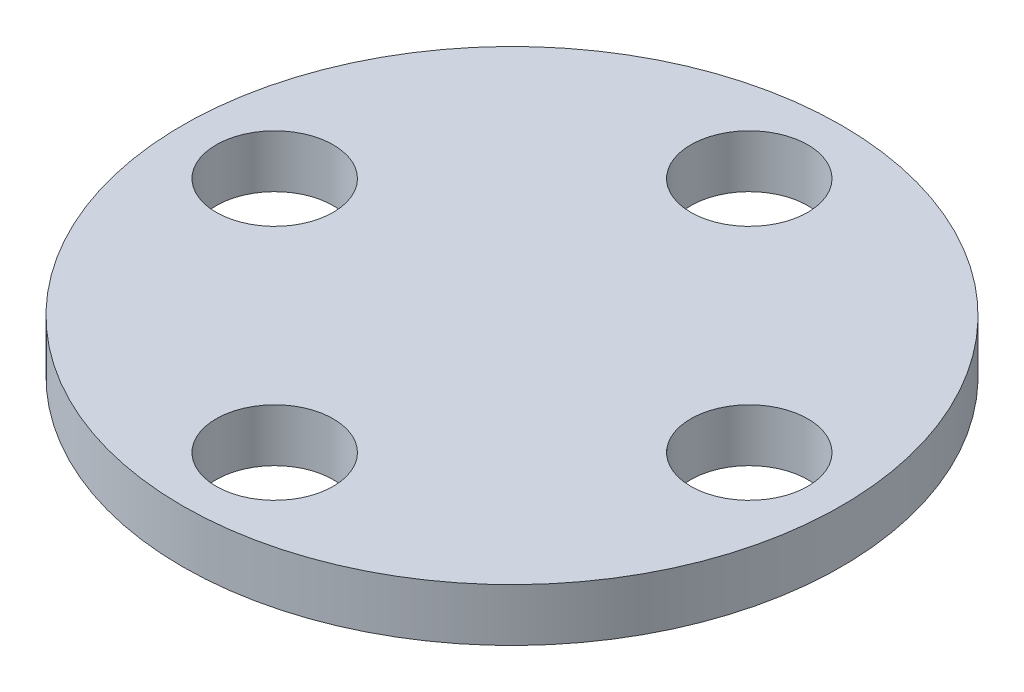
ISO-10303-21;
HEADER;
FILE_DESCRIPTION(('STEP AP214'),'2;1');
FILE_NAME('part.step','',(''),(''),'','','');
FILE_SCHEMA(('AUTOMOTIVE_DESIGN { 1 0 10303 214 1 1 1 1 }'));
ENDSEC;
DATA;
#1=APPLICATION_CONTEXT('core data for automotive mechanical design processes');
#2=APPLICATION_PROTOCOL_DEFINITION('international standard','automotive_design',2000,#1);
#3=PRODUCT_CONTEXT('',#1,'mechanical');
#4=PRODUCT('Part','Part','',(#3));
#5=PRODUCT_RELATED_PRODUCT_CATEGORY('part','',(#4));
#6=PRODUCT_DEFINITION_FORMATION('','',#4);
#7=PRODUCT_DEFINITION_CONTEXT('part definition',#1,'design');
#8=PRODUCT_DEFINITION('design','',#6,#7);
#9=PRODUCT_DEFINITION_SHAPE('','',#8);
#10=(LENGTH_UNIT() NAMED_UNIT(*) SI_UNIT(.MILLI.,.METRE.));
#11=(NAMED_UNIT(*) PLANE_ANGLE_UNIT() SI_UNIT($,.RADIAN.));
#12=(NAMED_UNIT(*) SI_UNIT($,.STERADIAN.) SOLID_ANGLE_UNIT());
#13=UNCERTAINTY_MEASURE_WITH_UNIT(LENGTH_MEASURE(1.E-05),#10,'distance_accuracy_value','');
#14=(GEOMETRIC_REPRESENTATION_CONTEXT(3) GLOBAL_UNCERTAINTY_ASSIGNED_CONTEXT((#13)) GLOBAL_UNIT_ASSIGNED_CONTEXT((#10,
#11,#12)) REPRESENTATION_CONTEXT('',''));
#15=CARTESIAN_POINT('',(0.,0.,0.));
#16=DIRECTION('',(0.,0.,1.));
#17=DIRECTION('',(1.,0.,0.));
#18=AXIS2_PLACEMENT_3D('',#15,#16,#17);
#19=CARTESIAN_POINT('',(0.,2.54,0.));
#20=DIRECTION('',(0.,-1.,0.));
#21=DIRECTION('',(0.,0.,-1.));
#22=AXIS2_PLACEMENT_3D('',#19,#20,#21);
#23=CYLINDRICAL_SURFACE('',#22,15.875);
#24=CARTESIAN_POINT('',(0.,2.54,0.));
#25=DIRECTION('',(0.,1.,0.));
#26=DIRECTION('',(0.,0.,1.));
#27=AXIS2_PLACEMENT_3D('',#24,#25,#26);
#28=CIRCLE('',#27,15.875);
#29=CARTESIAN_POINT('',(0.,2.54,15.875));
#30=VERTEX_POINT('',#29);
#31=EDGE_CURVE('E10',#30,#30,#28,.T.);
#32=ORIENTED_EDGE('',*,*,#31,.F.);
#33=EDGE_LOOP('',(#32));
#34=FACE_BOUND('',#33,.T.);
#35=CARTESIAN_POINT('',(0.,0.,0.));
#36=DIRECTION('',(0.,1.,0.));
#37=DIRECTION('',(0.,0.,1.));
#38=AXIS2_PLACEMENT_3D('',#35,#36,#37);
#39=CIRCLE('',#38,15.875);
#40=CARTESIAN_POINT('',(0.,0.,15.875));
#41=VERTEX_POINT('',#40);
#42=EDGE_CURVE('E40',#41,#41,#39,.T.);
#43=ORIENTED_EDGE('',*,*,#42,.T.);
#44=EDGE_LOOP('',(#43));
#45=FACE_BOUND('',#44,.T.);
#46=ADVANCED_FACE('F37',(#34,#45),#23,.T.);
#47=CARTESIAN_POINT('',(0.,2.54,0.));
#48=DIRECTION('',(0.,1.,0.));
#49=DIRECTION('',(0.,0.,1.));
#50=AXIS2_PLACEMENT_3D('',#47,#48,#49);
#51=PLANE('',#50);
#52=CARTESIAN_POINT('',(0.,2.54,-11.43));
#53=DIRECTION('',(0.,1.,0.));
#54=DIRECTION('',(0.,0.,1.));
#55=AXIS2_PLACEMENT_3D('',#52,#53,#54);
#56=CIRCLE('',#55,2.8194);
#57=CARTESIAN_POINT('',(0.,2.54,-8.6106));
#58=VERTEX_POINT('',#57);
#59=EDGE_CURVE('E75',#58,#58,#56,.T.);
#60=ORIENTED_EDGE('',*,*,#59,.F.);
#61=EDGE_LOOP('',(#60));
#62=FACE_BOUND('',#61,.T.);
#63=CARTESIAN_POINT('',(11.4300000000003,2.54,-3.23460367498092E-13));
#64=DIRECTION('',(0.,1.,0.));
#65=DIRECTION('',(0.,0.,1.));
#66=AXIS2_PLACEMENT_3D('',#63,#64,#65);
#67=CIRCLE('',#66,2.81940000000025);
#68=CARTESIAN_POINT('',(11.4300000000003,2.54,2.81939999999993));
#69=VERTEX_POINT('',#68);
#70=EDGE_CURVE('E67',#69,#69,#67,.T.);
#71=ORIENTED_EDGE('',*,*,#70,.F.);
#72=EDGE_LOOP('',(#71));
#73=FACE_BOUND('',#72,.T.);
#74=CARTESIAN_POINT('',(6.46920734996185E-13,2.54,11.43));
#75=DIRECTION('',(0.,1.,0.));
#76=DIRECTION('',(0.,0.,1.));
#77=AXIS2_PLACEMENT_3D('',#74,#75,#76);
#78=CIRCLE('',#77,2.81940000000069);
#79=CARTESIAN_POINT('',(6.46920734996185E-13,2.54,14.2494000000007));
#80=VERTEX_POINT('',#79);
#81=EDGE_CURVE('E59',#80,#80,#78,.T.);
#82=ORIENTED_EDGE('',*,*,#81,.F.);
#83=EDGE_LOOP('',(#82));
#84=FACE_BOUND('',#83,.T.);
#85=CARTESIAN_POINT('',(-11.4299999999997,2.54,3.24860138789518E-13));
#86=DIRECTION('',(0.,1.,0.));
#87=DIRECTION('',(0.,0.,1.));
#88=AXIS2_PLACEMENT_3D('',#85,#86,#87);
#89=CIRCLE('',#88,2.81940000000052);
#90=CARTESIAN_POINT('',(-11.4299999999997,2.54,2.81940000000084));
#91=VERTEX_POINT('',#90);
#92=EDGE_CURVE('E51',#91,#91,#89,.T.);
#93=ORIENTED_EDGE('',*,*,#92,.F.);
#94=EDGE_LOOP('',(#93));
#95=FACE_BOUND('',#94,.T.);
#96=ORIENTED_EDGE('',*,*,#31,.T.);
#97=EDGE_LOOP('',(#96));
#98=FACE_BOUND('',#97,.T.);
#99=ADVANCED_FACE('F93',(#62,#73,#84,#95,#98),#51,.T.);
#100=CARTESIAN_POINT('',(0.,0.,0.));
#101=DIRECTION('',(0.,1.,0.));
#102=DIRECTION('',(0.,0.,1.));
#103=AXIS2_PLACEMENT_3D('',#100,#101,#102);
#104=PLANE('',#103);
#105=CARTESIAN_POINT('',(0.,0.,-11.43));
#106=DIRECTION('',(0.,1.,0.));
#107=DIRECTION('',(0.,0.,1.));
#108=AXIS2_PLACEMENT_3D('',#105,#106,#107);
#109=CIRCLE('',#108,2.8194);
#110=CARTESIAN_POINT('',(0.,0.,-8.6106));
#111=VERTEX_POINT('',#110);
#112=EDGE_CURVE('E49',#111,#111,#109,.T.);
#113=ORIENTED_EDGE('',*,*,#112,.T.);
#114=EDGE_LOOP('',(#113));
#115=FACE_BOUND('',#114,.T.);
#116=CARTESIAN_POINT('',(11.4300000000003,0.,-3.23460367498092E-13));
#117=DIRECTION('',(0.,1.,0.));
#118=DIRECTION('',(0.,0.,1.));
#119=AXIS2_PLACEMENT_3D('',#116,#117,#118);
#120=CIRCLE('',#119,2.81940000000025);
#121=CARTESIAN_POINT('',(11.4300000000003,0.,2.81939999999993));
#122=VERTEX_POINT('',#121);
#123=EDGE_CURVE('E71',#122,#122,#120,.T.);
#124=ORIENTED_EDGE('',*,*,#123,.T.);
#125=EDGE_LOOP('',(#124));
#126=FACE_BOUND('',#125,.T.);
#127=CARTESIAN_POINT('',(6.46920734996185E-13,0.,11.43));
#128=DIRECTION('',(0.,1.,0.));
#129=DIRECTION('',(0.,0.,1.));
#130=AXIS2_PLACEMENT_3D('',#127,#128,#129);
#131=CIRCLE('',#130,2.81940000000069);
#132=CARTESIAN_POINT('',(6.46920734996185E-13,0.,14.2494000000007));
#133=VERTEX_POINT('',#132);
#134=EDGE_CURVE('E63',#133,#133,#131,.T.);
#135=ORIENTED_EDGE('',*,*,#134,.T.);
#136=EDGE_LOOP('',(#135));
#137=FACE_BOUND('',#136,.T.);
#138=CARTESIAN_POINT('',(-11.4299999999997,0.,3.24860138789518E-13));
#139=DIRECTION('',(0.,1.,0.));
#140=DIRECTION('',(0.,0.,1.));
#141=AXIS2_PLACEMENT_3D('',#138,#139,#140);
#142=CIRCLE('',#141,2.81940000000052);
#143=CARTESIAN_POINT('',(-11.4299999999997,0.,2.81940000000084));
#144=VERTEX_POINT('',#143);
#145=EDGE_CURVE('E55',#144,#144,#142,.T.);
#146=ORIENTED_EDGE('',*,*,#145,.T.);
#147=EDGE_LOOP('',(#146));
#148=FACE_BOUND('',#147,.T.);
#149=ORIENTED_EDGE('',*,*,#42,.F.);
#150=EDGE_LOOP('',(#149));
#151=FACE_BOUND('',#150,.T.);
#152=ADVANCED_FACE('F83',(#115,#126,#137,#148,#151),#104,.F.);
#153=CARTESIAN_POINT('',(-11.4299999999997,0.,3.24860138789518E-13));
#154=DIRECTION('',(0.,1.,0.));
#155=DIRECTION('',(0.,0.,1.));
#156=AXIS2_PLACEMENT_3D('',#153,#154,#155);
#157=CYLINDRICAL_SURFACE('',#156,2.81940000000052);
#158=ORIENTED_EDGE('',*,*,#145,.F.);
#159=EDGE_LOOP('',(#158));
#160=FACE_BOUND('',#159,.T.);
#161=ORIENTED_EDGE('',*,*,#92,.T.);
#162=EDGE_LOOP('',(#161));
#163=FACE_BOUND('',#162,.T.);
#164=ADVANCED_FACE('F103',(#160,#163),#157,.F.);
#165=CARTESIAN_POINT('',(6.46920734996185E-13,0.,11.43));
#166=DIRECTION('',(0.,1.,0.));
#167=DIRECTION('',(0.,0.,1.));
#168=AXIS2_PLACEMENT_3D('',#165,#166,#167);
#169=CYLINDRICAL_SURFACE('',#168,2.81940000000069);
#170=ORIENTED_EDGE('',*,*,#134,.F.);
#171=EDGE_LOOP('',(#170));
#172=FACE_BOUND('',#171,.T.);
#173=ORIENTED_EDGE('',*,*,#81,.T.);
#174=EDGE_LOOP('',(#173));
#175=FACE_BOUND('',#174,.T.);
#176=ADVANCED_FACE('F105',(#172,#175),#169,.F.);
#177=CARTESIAN_POINT('',(11.4300000000003,0.,-3.23460367498092E-13));
#178=DIRECTION('',(0.,1.,0.));
#179=DIRECTION('',(0.,0.,1.));
#180=AXIS2_PLACEMENT_3D('',#177,#178,#179);
#181=CYLINDRICAL_SURFACE('',#180,2.81940000000025);
#182=ORIENTED_EDGE('',*,*,#123,.F.);
#183=EDGE_LOOP('',(#182));
#184=FACE_BOUND('',#183,.T.);
#185=ORIENTED_EDGE('',*,*,#70,.T.);
#186=EDGE_LOOP('',(#185));
#187=FACE_BOUND('',#186,.T.);
#188=ADVANCED_FACE('F89',(#184,#187),#181,.F.);
#189=CARTESIAN_POINT('',(0.,0.,-11.43));
#190=DIRECTION('',(0.,1.,0.));
#191=DIRECTION('',(0.,0.,1.));
#192=AXIS2_PLACEMENT_3D('',#189,#190,#191);
#193=CYLINDRICAL_SURFACE('',#192,2.8194);
#194=ORIENTED_EDGE('',*,*,#112,.F.);
#195=EDGE_LOOP('',(#194));
#196=FACE_BOUND('',#195,.T.);
#197=ORIENTED_EDGE('',*,*,#59,.T.);
#198=EDGE_LOOP('',(#197));
#199=FACE_BOUND('',#198,.T.);
#200=ADVANCED_FACE('F86',(#196,#199),#193,.F.);
#201=CLOSED_SHELL('',(#46,#99,#152,#164,#176,#188,#200));
#202=MANIFOLD_SOLID_BREP('B2',#201);
#203=ADVANCED_BREP_SHAPE_REPRESENTATION('',(#18,#202),#14);
#204=SHAPE_DEFINITION_REPRESENTATION(#9,#203);
ENDSEC;
END-ISO-10303-21;
